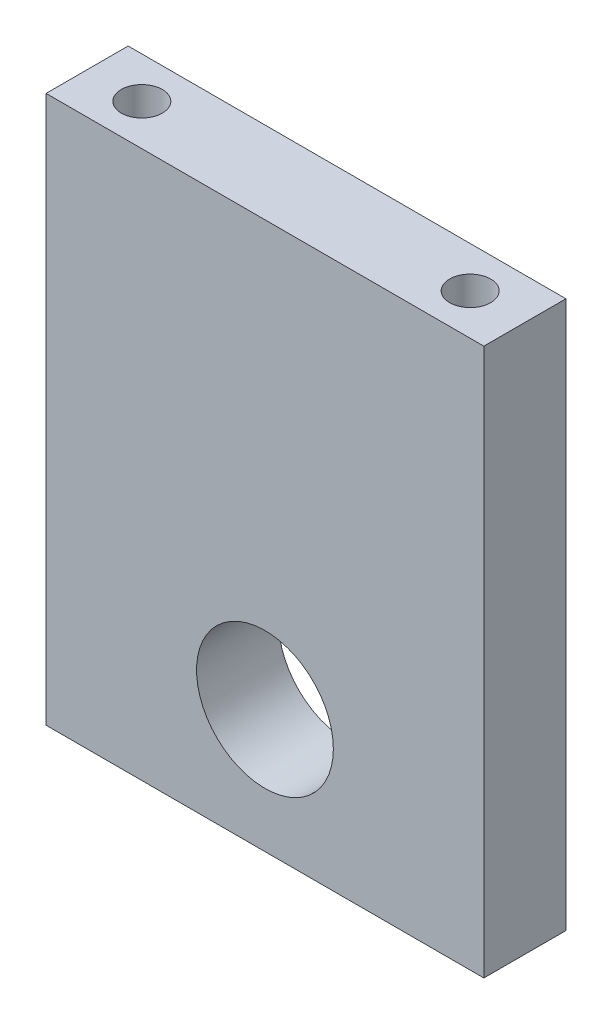
ISO-10303-21;
HEADER;
FILE_DESCRIPTION(('STEP AP214'),'2;1');
FILE_NAME('part.step','',(''),(''),'','','');
FILE_SCHEMA(('AUTOMOTIVE_DESIGN { 1 0 10303 214 1 1 1 1 }'));
ENDSEC;
DATA;
#1=APPLICATION_CONTEXT('core data for automotive mechanical design processes');
#2=APPLICATION_PROTOCOL_DEFINITION('international standard','automotive_design',2000,#1);
#3=PRODUCT_CONTEXT('',#1,'mechanical');
#4=PRODUCT('Part','Part','',(#3));
#5=PRODUCT_RELATED_PRODUCT_CATEGORY('part','',(#4));
#6=PRODUCT_DEFINITION_FORMATION('','',#4);
#7=PRODUCT_DEFINITION_CONTEXT('part definition',#1,'design');
#8=PRODUCT_DEFINITION('design','',#6,#7);
#9=PRODUCT_DEFINITION_SHAPE('','',#8);
#10=(LENGTH_UNIT() NAMED_UNIT(*) SI_UNIT(.MILLI.,.METRE.));
#11=(NAMED_UNIT(*) PLANE_ANGLE_UNIT() SI_UNIT($,.RADIAN.));
#12=(NAMED_UNIT(*) SI_UNIT($,.STERADIAN.) SOLID_ANGLE_UNIT());
#13=UNCERTAINTY_MEASURE_WITH_UNIT(LENGTH_MEASURE(1.E-05),#10,'distance_accuracy_value','');
#14=(GEOMETRIC_REPRESENTATION_CONTEXT(3) GLOBAL_UNCERTAINTY_ASSIGNED_CONTEXT((#13)) GLOBAL_UNIT_ASSIGNED_CONTEXT((#10,
#11,#12)) REPRESENTATION_CONTEXT('',''));
#15=CARTESIAN_POINT('',(0.,0.,0.));
#16=DIRECTION('',(0.,0.,1.));
#17=DIRECTION('',(1.,0.,0.));
#18=AXIS2_PLACEMENT_3D('',#15,#16,#17);
#19=CARTESIAN_POINT('',(-16.,31.,6.));
#20=DIRECTION('',(0.,1.,0.));
#21=DIRECTION('',(0.,0.,1.));
#22=AXIS2_PLACEMENT_3D('',#19,#20,#21);
#23=PLANE('',#22);
#24=CARTESIAN_POINT('',(-12.,31.,3.));
#25=DIRECTION('',(0.,1.,0.));
#26=DIRECTION('',(0.,0.,1.));
#27=AXIS2_PLACEMENT_3D('',#24,#25,#26);
#28=CIRCLE('',#27,1.5);
#29=CARTESIAN_POINT('',(-12.,31.,4.5));
#30=VERTEX_POINT('',#29);
#31=EDGE_CURVE('E166',#30,#30,#28,.T.);
#32=ORIENTED_EDGE('',*,*,#31,.F.);
#33=EDGE_LOOP('',(#32));
#34=FACE_BOUND('',#33,.T.);
#35=DIRECTION('',(1.,0.,0.));
#36=VECTOR('',#35,1.);
#37=CARTESIAN_POINT('',(-16.,31.,0.));
#38=LINE('',#37,#36);
#39=CARTESIAN_POINT('',(-16.,31.,0.));
#40=VERTEX_POINT('',#39);
#41=CARTESIAN_POINT('',(16.,31.,0.));
#42=VERTEX_POINT('',#41);
#43=EDGE_CURVE('E130',#40,#42,#38,.T.);
#44=ORIENTED_EDGE('',*,*,#43,.F.);
#45=DIRECTION('',(0.,0.,-1.));
#46=VECTOR('',#45,1.);
#47=CARTESIAN_POINT('',(-16.,31.,6.));
#48=LINE('',#47,#46);
#49=CARTESIAN_POINT('',(-16.,31.,6.));
#50=VERTEX_POINT('',#49);
#51=EDGE_CURVE('E45',#50,#40,#48,.T.);
#52=ORIENTED_EDGE('',*,*,#51,.F.);
#53=DIRECTION('',(1.,0.,0.));
#54=VECTOR('',#53,1.);
#55=CARTESIAN_POINT('',(-16.,31.,6.));
#56=LINE('',#55,#54);
#57=CARTESIAN_POINT('',(16.,31.,6.));
#58=VERTEX_POINT('',#57);
#59=EDGE_CURVE('E143',#50,#58,#56,.T.);
#60=ORIENTED_EDGE('',*,*,#59,.T.);
#61=DIRECTION('',(0.,0.,-1.));
#62=VECTOR('',#61,1.);
#63=CARTESIAN_POINT('',(16.,31.,6.));
#64=LINE('',#63,#62);
#65=EDGE_CURVE('E146',#58,#42,#64,.T.);
#66=ORIENTED_EDGE('',*,*,#65,.T.);
#67=EDGE_LOOP('',(#44,#52,#60,#66));
#68=FACE_BOUND('',#67,.T.);
#69=CARTESIAN_POINT('',(12.,31.,3.));
#70=DIRECTION('',(0.,1.,0.));
#71=DIRECTION('',(0.,0.,1.));
#72=AXIS2_PLACEMENT_3D('',#69,#70,#71);
#73=CIRCLE('',#72,1.5);
#74=CARTESIAN_POINT('',(12.,31.,4.5));
#75=VERTEX_POINT('',#74);
#76=EDGE_CURVE('E177',#75,#75,#73,.T.);
#77=ORIENTED_EDGE('',*,*,#76,.F.);
#78=EDGE_LOOP('',(#77));
#79=FACE_BOUND('',#78,.T.);
#80=ADVANCED_FACE('F30',(#34,#68,#79),#23,.T.);
#81=CARTESIAN_POINT('',(-16.,-9.,6.));
#82=DIRECTION('',(0.,0.,-1.));
#83=DIRECTION('',(-1.,0.,0.));
#84=AXIS2_PLACEMENT_3D('',#81,#82,#83);
#85=PLANE('',#84);
#86=DIRECTION('',(0.,-1.,0.));
#87=VECTOR('',#86,1.);
#88=CARTESIAN_POINT('',(-16.,31.,6.));
#89=LINE('',#88,#87);
#90=CARTESIAN_POINT('',(-16.,-9.,6.));
#91=VERTEX_POINT('',#90);
#92=EDGE_CURVE('E138',#50,#91,#89,.T.);
#93=ORIENTED_EDGE('',*,*,#92,.T.);
#94=DIRECTION('',(-1.,0.,0.));
#95=VECTOR('',#94,1.);
#96=CARTESIAN_POINT('',(16.,-9.,6.));
#97=LINE('',#96,#95);
#98=CARTESIAN_POINT('',(16.,-9.,6.));
#99=VERTEX_POINT('',#98);
#100=EDGE_CURVE('E140',#99,#91,#97,.T.);
#101=ORIENTED_EDGE('',*,*,#100,.F.);
#102=DIRECTION('',(0.,1.,0.));
#103=VECTOR('',#102,1.);
#104=CARTESIAN_POINT('',(16.,-9.,6.));
#105=LINE('',#104,#103);
#106=EDGE_CURVE('E53',#99,#58,#105,.T.);
#107=ORIENTED_EDGE('',*,*,#106,.T.);
#108=ORIENTED_EDGE('',*,*,#59,.F.);
#109=EDGE_LOOP('',(#93,#101,#107,#108));
#110=FACE_BOUND('',#109,.T.);
#111=CARTESIAN_POINT('',(0.,0.,6.));
#112=DIRECTION('',(0.,0.,1.));
#113=DIRECTION('',(1.,0.,0.));
#114=AXIS2_PLACEMENT_3D('',#111,#112,#113);
#115=CIRCLE('',#114,5.);
#116=CARTESIAN_POINT('',(5.,0.,6.));
#117=VERTEX_POINT('',#116);
#118=EDGE_CURVE('E132',#117,#117,#115,.T.);
#119=ORIENTED_EDGE('',*,*,#118,.F.);
#120=EDGE_LOOP('',(#119));
#121=FACE_BOUND('',#120,.T.);
#122=ADVANCED_FACE('F95',(#110,#121),#85,.F.);
#123=CARTESIAN_POINT('',(-16.,-9.,0.));
#124=DIRECTION('',(0.,0.,-1.));
#125=DIRECTION('',(-1.,0.,0.));
#126=AXIS2_PLACEMENT_3D('',#123,#124,#125);
#127=PLANE('',#126);
#128=DIRECTION('',(0.,-1.,0.));
#129=VECTOR('',#128,1.);
#130=CARTESIAN_POINT('',(-16.,31.,0.));
#131=LINE('',#130,#129);
#132=CARTESIAN_POINT('',(-16.,-9.,0.));
#133=VERTEX_POINT('',#132);
#134=EDGE_CURVE('E127',#40,#133,#131,.T.);
#135=ORIENTED_EDGE('',*,*,#134,.F.);
#136=ORIENTED_EDGE('',*,*,#43,.T.);
#137=DIRECTION('',(0.,1.,0.));
#138=VECTOR('',#137,1.);
#139=CARTESIAN_POINT('',(16.,-9.,0.));
#140=LINE('',#139,#138);
#141=CARTESIAN_POINT('',(16.,-9.,0.));
#142=VERTEX_POINT('',#141);
#143=EDGE_CURVE('E126',#142,#42,#140,.T.);
#144=ORIENTED_EDGE('',*,*,#143,.F.);
#145=DIRECTION('',(-1.,0.,0.));
#146=VECTOR('',#145,1.);
#147=CARTESIAN_POINT('',(16.,-9.,0.));
#148=LINE('',#147,#146);
#149=EDGE_CURVE('E119',#142,#133,#148,.T.);
#150=ORIENTED_EDGE('',*,*,#149,.T.);
#151=EDGE_LOOP('',(#135,#136,#144,#150));
#152=FACE_BOUND('',#151,.T.);
#153=CARTESIAN_POINT('',(0.,0.,0.));
#154=DIRECTION('',(0.,0.,1.));
#155=DIRECTION('',(1.,0.,0.));
#156=AXIS2_PLACEMENT_3D('',#153,#154,#155);
#157=CIRCLE('',#156,5.);
#158=CARTESIAN_POINT('',(5.,0.,0.));
#159=VERTEX_POINT('',#158);
#160=EDGE_CURVE('E153',#159,#159,#157,.T.);
#161=ORIENTED_EDGE('',*,*,#160,.T.);
#162=EDGE_LOOP('',(#161));
#163=FACE_BOUND('',#162,.T.);
#164=ADVANCED_FACE('F101',(#152,#163),#127,.T.);
#165=CARTESIAN_POINT('',(-16.,31.,6.));
#166=DIRECTION('',(1.,0.,0.));
#167=DIRECTION('',(0.,1.,0.));
#168=AXIS2_PLACEMENT_3D('',#165,#166,#167);
#169=PLANE('',#168);
#170=ORIENTED_EDGE('',*,*,#134,.T.);
#171=DIRECTION('',(0.,0.,-1.));
#172=VECTOR('',#171,1.);
#173=CARTESIAN_POINT('',(-16.,-9.,6.));
#174=LINE('',#173,#172);
#175=EDGE_CURVE('E11',#91,#133,#174,.T.);
#176=ORIENTED_EDGE('',*,*,#175,.F.);
#177=ORIENTED_EDGE('',*,*,#92,.F.);
#178=ORIENTED_EDGE('',*,*,#51,.T.);
#179=EDGE_LOOP('',(#170,#176,#177,#178));
#180=FACE_BOUND('',#179,.T.);
#181=ADVANCED_FACE('F32',(#180),#169,.F.);
#182=CARTESIAN_POINT('',(16.,-9.,6.));
#183=DIRECTION('',(0.,-1.,0.));
#184=DIRECTION('',(0.,0.,-1.));
#185=AXIS2_PLACEMENT_3D('',#182,#183,#184);
#186=PLANE('',#185);
#187=ORIENTED_EDGE('',*,*,#149,.F.);
#188=DIRECTION('',(0.,0.,-1.));
#189=VECTOR('',#188,1.);
#190=CARTESIAN_POINT('',(16.,-9.,6.));
#191=LINE('',#190,#189);
#192=EDGE_CURVE('E38',#99,#142,#191,.T.);
#193=ORIENTED_EDGE('',*,*,#192,.F.);
#194=ORIENTED_EDGE('',*,*,#100,.T.);
#195=ORIENTED_EDGE('',*,*,#175,.T.);
#196=EDGE_LOOP('',(#187,#193,#194,#195));
#197=FACE_BOUND('',#196,.T.);
#198=ADVANCED_FACE('F109',(#197),#186,.T.);
#199=CARTESIAN_POINT('',(16.,-9.,6.));
#200=DIRECTION('',(-1.,0.,0.));
#201=DIRECTION('',(0.,-1.,0.));
#202=AXIS2_PLACEMENT_3D('',#199,#200,#201);
#203=PLANE('',#202);
#204=ORIENTED_EDGE('',*,*,#143,.T.);
#205=ORIENTED_EDGE('',*,*,#65,.F.);
#206=ORIENTED_EDGE('',*,*,#106,.F.);
#207=ORIENTED_EDGE('',*,*,#192,.T.);
#208=EDGE_LOOP('',(#204,#205,#206,#207));
#209=FACE_BOUND('',#208,.T.);
#210=ADVANCED_FACE('F106',(#209),#203,.F.);
#211=CARTESIAN_POINT('',(0.,0.,6.));
#212=DIRECTION('',(0.,0.,-1.));
#213=DIRECTION('',(-1.,0.,0.));
#214=AXIS2_PLACEMENT_3D('',#211,#212,#213);
#215=CYLINDRICAL_SURFACE('',#214,5.);
#216=ORIENTED_EDGE('',*,*,#118,.T.);
#217=EDGE_LOOP('',(#216));
#218=FACE_BOUND('',#217,.T.);
#219=ORIENTED_EDGE('',*,*,#160,.F.);
#220=EDGE_LOOP('',(#219));
#221=FACE_BOUND('',#220,.T.);
#222=ADVANCED_FACE('F108',(#218,#221),#215,.F.);
#223=CARTESIAN_POINT('',(-12.,19.5493545357293,3.));
#224=DIRECTION('',(0.,1.,0.));
#225=DIRECTION('',(0.,0.,1.));
#226=AXIS2_PLACEMENT_3D('',#223,#224,#225);
#227=CONICAL_SURFACE('',#226,0.,1.02974425867666);
#228=CARTESIAN_POINT('',(-12.,20.,3.));
#229=DIRECTION('',(0.,1.,0.));
#230=DIRECTION('',(0.,0.,1.));
#231=AXIS2_PLACEMENT_3D('',#228,#229,#230);
#232=CIRCLE('',#231,0.750000000000001);
#233=CARTESIAN_POINT('',(-12.,20.,3.75));
#234=VERTEX_POINT('',#233);
#235=EDGE_CURVE('E155',#234,#234,#232,.T.);
#236=ORIENTED_EDGE('',*,*,#235,.T.);
#237=EDGE_LOOP('',(#236));
#238=FACE_BOUND('',#237,.T.);
#239=CARTESIAN_POINT('',(-12.,19.5493545357293,3.));
#240=VERTEX_POINT('',#239);
#241=VERTEX_LOOP('',#240);
#242=FACE_BOUND('',#241,.T.);
#243=ADVANCED_FACE('F240',(#238,#242),#227,.F.);
#244=CARTESIAN_POINT('',(-12.,31.,3.));
#245=DIRECTION('',(0.,1.,0.));
#246=DIRECTION('',(0.,0.,1.));
#247=AXIS2_PLACEMENT_3D('',#244,#245,#246);
#248=CYLINDRICAL_SURFACE('',#247,0.750000000000001);
#249=CARTESIAN_POINT('',(-12.,23.,3.));
#250=DIRECTION('',(0.,1.,0.));
#251=DIRECTION('',(0.,0.,1.));
#252=AXIS2_PLACEMENT_3D('',#249,#250,#251);
#253=CIRCLE('',#252,0.750000000000001);
#254=CARTESIAN_POINT('',(-12.,23.,3.75));
#255=VERTEX_POINT('',#254);
#256=EDGE_CURVE('E160',#255,#255,#253,.T.);
#257=ORIENTED_EDGE('',*,*,#256,.T.);
#258=EDGE_LOOP('',(#257));
#259=FACE_BOUND('',#258,.T.);
#260=ORIENTED_EDGE('',*,*,#235,.F.);
#261=EDGE_LOOP('',(#260));
#262=FACE_BOUND('',#261,.T.);
#263=ADVANCED_FACE('F231',(#259,#262),#248,.F.);
#264=CARTESIAN_POINT('',(-11.25,23.,3.));
#265=DIRECTION('',(0.,1.,0.));
#266=DIRECTION('',(0.,0.,1.));
#267=AXIS2_PLACEMENT_3D('',#264,#265,#266);
#268=PLANE('',#267);
#269=CARTESIAN_POINT('',(-12.,23.,3.));
#270=DIRECTION('',(0.,1.,0.));
#271=DIRECTION('',(0.,0.,1.));
#272=AXIS2_PLACEMENT_3D('',#269,#270,#271);
#273=CIRCLE('',#272,1.5);
#274=CARTESIAN_POINT('',(-12.,23.,4.5));
#275=VERTEX_POINT('',#274);
#276=EDGE_CURVE('E163',#275,#275,#273,.T.);
#277=ORIENTED_EDGE('',*,*,#276,.T.);
#278=EDGE_LOOP('',(#277));
#279=FACE_BOUND('',#278,.T.);
#280=ORIENTED_EDGE('',*,*,#256,.F.);
#281=EDGE_LOOP('',(#280));
#282=FACE_BOUND('',#281,.T.);
#283=ADVANCED_FACE('F90',(#279,#282),#268,.T.);
#284=CARTESIAN_POINT('',(-12.,31.,3.));
#285=DIRECTION('',(0.,1.,0.));
#286=DIRECTION('',(0.,0.,1.));
#287=AXIS2_PLACEMENT_3D('',#284,#285,#286);
#288=CYLINDRICAL_SURFACE('',#287,1.5);
#289=ORIENTED_EDGE('',*,*,#31,.T.);
#290=EDGE_LOOP('',(#289));
#291=FACE_BOUND('',#290,.T.);
#292=ORIENTED_EDGE('',*,*,#276,.F.);
#293=EDGE_LOOP('',(#292));
#294=FACE_BOUND('',#293,.T.);
#295=ADVANCED_FACE('F80',(#291,#294),#288,.F.);
#296=CARTESIAN_POINT('',(12.,19.5493545357293,3.));
#297=DIRECTION('',(0.,1.,0.));
#298=DIRECTION('',(0.,0.,1.));
#299=AXIS2_PLACEMENT_3D('',#296,#297,#298);
#300=CONICAL_SURFACE('',#299,0.,1.02974425867666);
#301=CARTESIAN_POINT('',(12.,20.,3.));
#302=DIRECTION('',(0.,1.,0.));
#303=DIRECTION('',(0.,0.,1.));
#304=AXIS2_PLACEMENT_3D('',#301,#302,#303);
#305=CIRCLE('',#304,0.750000000000001);
#306=CARTESIAN_POINT('',(12.,20.,3.75));
#307=VERTEX_POINT('',#306);
#308=EDGE_CURVE('E169',#307,#307,#305,.T.);
#309=ORIENTED_EDGE('',*,*,#308,.T.);
#310=EDGE_LOOP('',(#309));
#311=FACE_BOUND('',#310,.T.);
#312=CARTESIAN_POINT('',(12.,19.5493545357293,3.));
#313=VERTEX_POINT('',#312);
#314=VERTEX_LOOP('',#313);
#315=FACE_BOUND('',#314,.T.);
#316=ADVANCED_FACE('F77',(#311,#315),#300,.F.);
#317=CARTESIAN_POINT('',(12.,31.,3.));
#318=DIRECTION('',(0.,1.,0.));
#319=DIRECTION('',(0.,0.,1.));
#320=AXIS2_PLACEMENT_3D('',#317,#318,#319);
#321=CYLINDRICAL_SURFACE('',#320,0.750000000000001);
#322=CARTESIAN_POINT('',(12.,23.,3.));
#323=DIRECTION('',(0.,1.,0.));
#324=DIRECTION('',(0.,0.,1.));
#325=AXIS2_PLACEMENT_3D('',#322,#323,#324);
#326=CIRCLE('',#325,0.750000000000001);
#327=CARTESIAN_POINT('',(12.,23.,3.75));
#328=VERTEX_POINT('',#327);
#329=EDGE_CURVE('E171',#328,#328,#326,.T.);
#330=ORIENTED_EDGE('',*,*,#329,.T.);
#331=EDGE_LOOP('',(#330));
#332=FACE_BOUND('',#331,.T.);
#333=ORIENTED_EDGE('',*,*,#308,.F.);
#334=EDGE_LOOP('',(#333));
#335=FACE_BOUND('',#334,.T.);
#336=ADVANCED_FACE('F79',(#332,#335),#321,.F.);
#337=CARTESIAN_POINT('',(12.75,23.,3.));
#338=DIRECTION('',(0.,1.,0.));
#339=DIRECTION('',(0.,0.,1.));
#340=AXIS2_PLACEMENT_3D('',#337,#338,#339);
#341=PLANE('',#340);
#342=CARTESIAN_POINT('',(12.,23.,3.));
#343=DIRECTION('',(0.,1.,0.));
#344=DIRECTION('',(0.,0.,1.));
#345=AXIS2_PLACEMENT_3D('',#342,#343,#344);
#346=CIRCLE('',#345,1.5);
#347=CARTESIAN_POINT('',(12.,23.,4.5));
#348=VERTEX_POINT('',#347);
#349=EDGE_CURVE('E174',#348,#348,#346,.T.);
#350=ORIENTED_EDGE('',*,*,#349,.T.);
#351=EDGE_LOOP('',(#350));
#352=FACE_BOUND('',#351,.T.);
#353=ORIENTED_EDGE('',*,*,#329,.F.);
#354=EDGE_LOOP('',(#353));
#355=FACE_BOUND('',#354,.T.);
#356=ADVANCED_FACE('F87',(#352,#355),#341,.T.);
#357=CARTESIAN_POINT('',(12.,31.,3.));
#358=DIRECTION('',(0.,1.,0.));
#359=DIRECTION('',(0.,0.,1.));
#360=AXIS2_PLACEMENT_3D('',#357,#358,#359);
#361=CYLINDRICAL_SURFACE('',#360,1.5);
#362=ORIENTED_EDGE('',*,*,#76,.T.);
#363=EDGE_LOOP('',(#362));
#364=FACE_BOUND('',#363,.T.);
#365=ORIENTED_EDGE('',*,*,#349,.F.);
#366=EDGE_LOOP('',(#365));
#367=FACE_BOUND('',#366,.T.);
#368=ADVANCED_FACE('F181',(#364,#367),#361,.F.);
#369=CLOSED_SHELL('',(#80,#122,#164,#181,#198,#210,#222,#243,#263,#283,#295,#316,#336,#356,#368));
#370=MANIFOLD_SOLID_BREP('B2',#369);
#371=ADVANCED_BREP_SHAPE_REPRESENTATION('',(#18,#370),#14);
#372=SHAPE_DEFINITION_REPRESENTATION(#9,#371);
ENDSEC;
END-ISO-10303-21;
